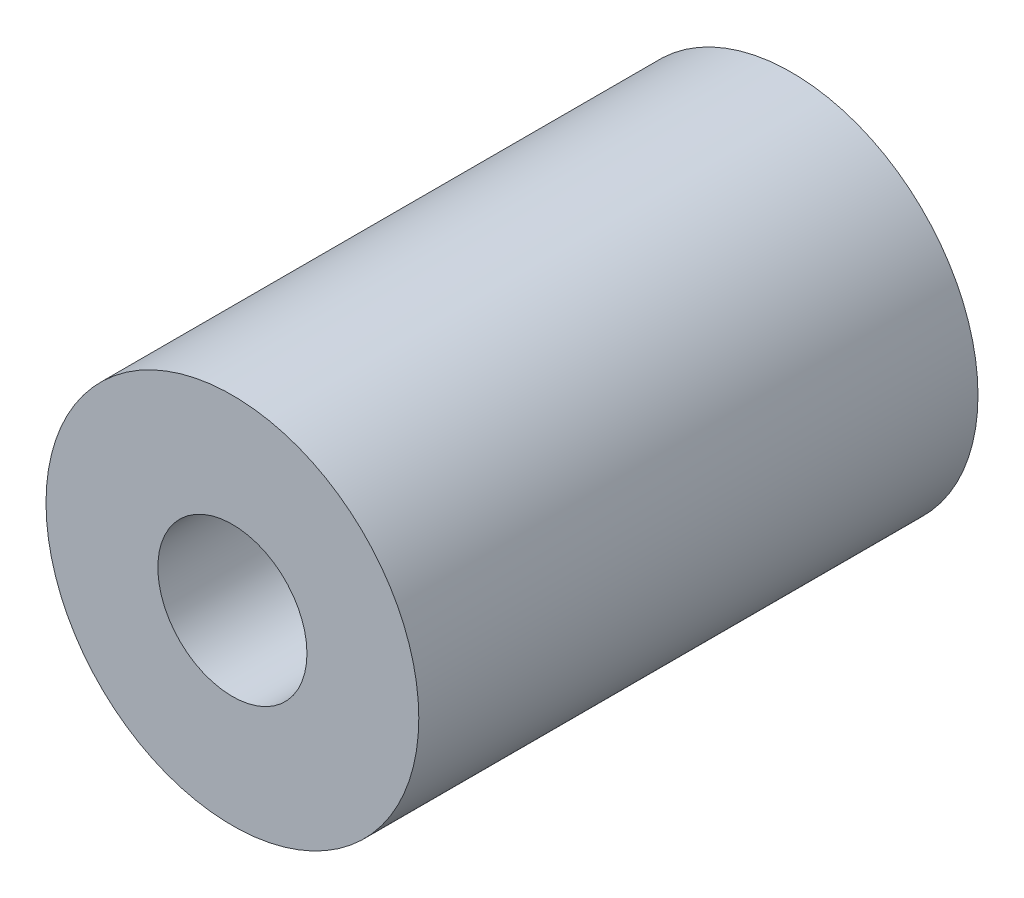
ISO-10303-21;
HEADER;
FILE_DESCRIPTION(('STEP AP214'),'2;1');
FILE_NAME('part.step','',(''),(''),'','','');
FILE_SCHEMA(('AUTOMOTIVE_DESIGN { 1 0 10303 214 1 1 1 1 }'));
ENDSEC;
DATA;
#1=APPLICATION_CONTEXT('core data for automotive mechanical design processes');
#2=APPLICATION_PROTOCOL_DEFINITION('international standard','automotive_design',2000,#1);
#3=PRODUCT_CONTEXT('',#1,'mechanical');
#4=PRODUCT('Part','Part','',(#3));
#5=PRODUCT_RELATED_PRODUCT_CATEGORY('part','',(#4));
#6=PRODUCT_DEFINITION_FORMATION('','',#4);
#7=PRODUCT_DEFINITION_CONTEXT('part definition',#1,'design');
#8=PRODUCT_DEFINITION('design','',#6,#7);
#9=PRODUCT_DEFINITION_SHAPE('','',#8);
#10=(LENGTH_UNIT() NAMED_UNIT(*) SI_UNIT(.MILLI.,.METRE.));
#11=(NAMED_UNIT(*) PLANE_ANGLE_UNIT() SI_UNIT($,.RADIAN.));
#12=(NAMED_UNIT(*) SI_UNIT($,.STERADIAN.) SOLID_ANGLE_UNIT());
#13=UNCERTAINTY_MEASURE_WITH_UNIT(LENGTH_MEASURE(1.E-05),#10,'distance_accuracy_value','');
#14=(GEOMETRIC_REPRESENTATION_CONTEXT(3) GLOBAL_UNCERTAINTY_ASSIGNED_CONTEXT((#13)) GLOBAL_UNIT_ASSIGNED_CONTEXT((#10,
#11,#12)) REPRESENTATION_CONTEXT('',''));
#15=CARTESIAN_POINT('',(0.,0.,0.));
#16=DIRECTION('',(0.,0.,1.));
#17=DIRECTION('',(1.,0.,0.));
#18=AXIS2_PLACEMENT_3D('',#15,#16,#17);
#19=CARTESIAN_POINT('',(0.,0.,15.));
#20=DIRECTION('',(0.,0.,1.));
#21=DIRECTION('',(1.,0.,0.));
#22=AXIS2_PLACEMENT_3D('',#19,#20,#21);
#23=PLANE('',#22);
#24=CARTESIAN_POINT('',(0.,0.,15.));
#25=DIRECTION('',(0.,0.,1.));
#26=DIRECTION('',(1.,0.,0.));
#27=AXIS2_PLACEMENT_3D('',#24,#25,#26);
#28=CIRCLE('',#27,5.);
#29=CARTESIAN_POINT('',(5.,0.,15.));
#30=VERTEX_POINT('',#29);
#31=EDGE_CURVE('E10',#30,#30,#28,.T.);
#32=ORIENTED_EDGE('',*,*,#31,.T.);
#33=EDGE_LOOP('',(#32));
#34=FACE_BOUND('',#33,.T.);
#35=CARTESIAN_POINT('',(0.,0.,15.));
#36=DIRECTION('',(0.,0.,1.));
#37=DIRECTION('',(1.,0.,0.));
#38=AXIS2_PLACEMENT_3D('',#35,#36,#37);
#39=CIRCLE('',#38,2.);
#40=CARTESIAN_POINT('',(2.,0.,15.));
#41=VERTEX_POINT('',#40);
#42=EDGE_CURVE('E56',#41,#41,#39,.T.);
#43=ORIENTED_EDGE('',*,*,#42,.F.);
#44=EDGE_LOOP('',(#43));
#45=FACE_BOUND('',#44,.T.);
#46=ADVANCED_FACE('F43',(#34,#45),#23,.T.);
#47=CARTESIAN_POINT('',(0.,0.,0.));
#48=DIRECTION('',(0.,0.,1.));
#49=DIRECTION('',(1.,0.,0.));
#50=AXIS2_PLACEMENT_3D('',#47,#48,#49);
#51=PLANE('',#50);
#52=CARTESIAN_POINT('',(0.,0.,0.));
#53=DIRECTION('',(0.,0.,1.));
#54=DIRECTION('',(1.,0.,0.));
#55=AXIS2_PLACEMENT_3D('',#52,#53,#54);
#56=CIRCLE('',#55,5.);
#57=CARTESIAN_POINT('',(5.,0.,0.));
#58=VERTEX_POINT('',#57);
#59=EDGE_CURVE('E47',#58,#58,#56,.T.);
#60=ORIENTED_EDGE('',*,*,#59,.F.);
#61=EDGE_LOOP('',(#60));
#62=FACE_BOUND('',#61,.T.);
#63=CARTESIAN_POINT('',(0.,0.,0.));
#64=DIRECTION('',(0.,0.,1.));
#65=DIRECTION('',(1.,0.,0.));
#66=AXIS2_PLACEMENT_3D('',#63,#64,#65);
#67=CIRCLE('',#66,2.);
#68=CARTESIAN_POINT('',(2.,0.,0.));
#69=VERTEX_POINT('',#68);
#70=EDGE_CURVE('E58',#69,#69,#67,.T.);
#71=ORIENTED_EDGE('',*,*,#70,.T.);
#72=EDGE_LOOP('',(#71));
#73=FACE_BOUND('',#72,.T.);
#74=ADVANCED_FACE('F70',(#62,#73),#51,.F.);
#75=CARTESIAN_POINT('',(0.,0.,15.));
#76=DIRECTION('',(0.,0.,-1.));
#77=DIRECTION('',(-1.,0.,0.));
#78=AXIS2_PLACEMENT_3D('',#75,#76,#77);
#79=CYLINDRICAL_SURFACE('',#78,5.);
#80=ORIENTED_EDGE('',*,*,#31,.F.);
#81=EDGE_LOOP('',(#80));
#82=FACE_BOUND('',#81,.T.);
#83=ORIENTED_EDGE('',*,*,#59,.T.);
#84=EDGE_LOOP('',(#83));
#85=FACE_BOUND('',#84,.T.);
#86=ADVANCED_FACE('F45',(#82,#85),#79,.T.);
#87=CARTESIAN_POINT('',(0.,0.,15.));
#88=DIRECTION('',(0.,0.,-1.));
#89=DIRECTION('',(-1.,0.,0.));
#90=AXIS2_PLACEMENT_3D('',#87,#88,#89);
#91=CYLINDRICAL_SURFACE('',#90,2.);
#92=ORIENTED_EDGE('',*,*,#42,.T.);
#93=EDGE_LOOP('',(#92));
#94=FACE_BOUND('',#93,.T.);
#95=ORIENTED_EDGE('',*,*,#70,.F.);
#96=EDGE_LOOP('',(#95));
#97=FACE_BOUND('',#96,.T.);
#98=ADVANCED_FACE('F66',(#94,#97),#91,.F.);
#99=CLOSED_SHELL('',(#46,#74,#86,#98));
#100=MANIFOLD_SOLID_BREP('B2',#99);
#101=ADVANCED_BREP_SHAPE_REPRESENTATION('',(#18,#100),#14);
#102=SHAPE_DEFINITION_REPRESENTATION(#9,#101);
ENDSEC;
END-ISO-10303-21;
